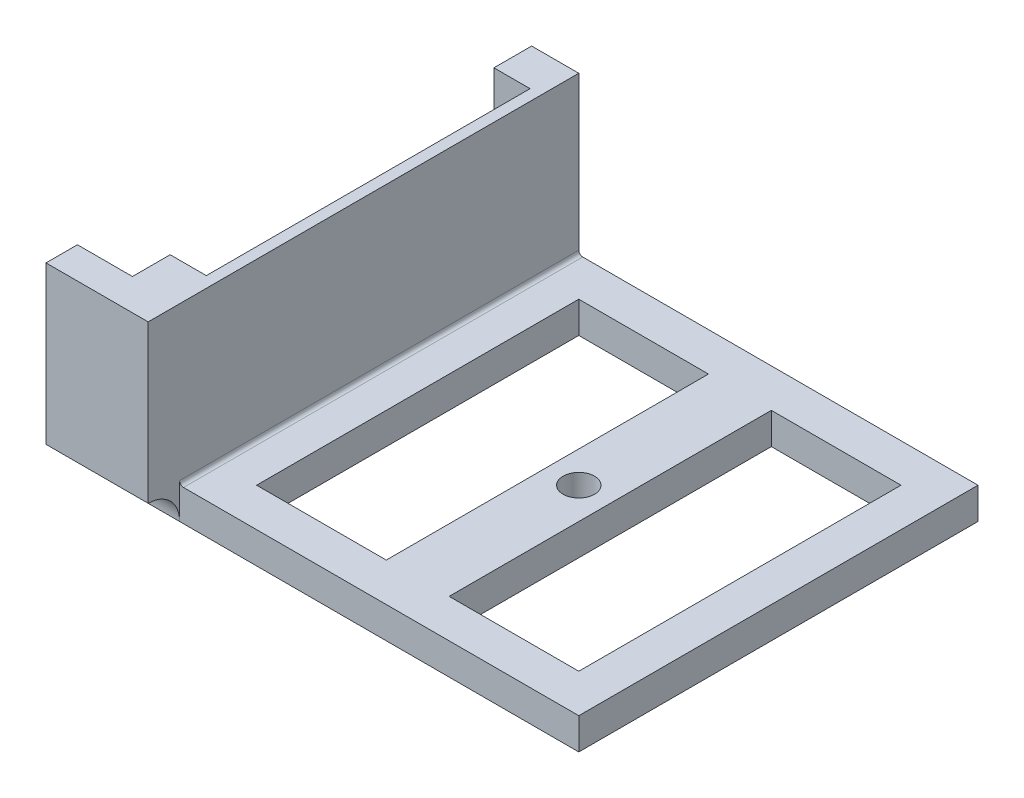
ISO-10303-21;
HEADER;
FILE_DESCRIPTION(('STEP AP214'),'2;1');
FILE_NAME('part.step','',(''),(''),'','','');
FILE_SCHEMA(('AUTOMOTIVE_DESIGN { 1 0 10303 214 1 1 1 1 }'));
ENDSEC;
DATA;
#1=APPLICATION_CONTEXT('core data for automotive mechanical design processes');
#2=APPLICATION_PROTOCOL_DEFINITION('international standard','automotive_design',2000,#1);
#3=PRODUCT_CONTEXT('',#1,'mechanical');
#4=PRODUCT('Part','Part','',(#3));
#5=PRODUCT_RELATED_PRODUCT_CATEGORY('part','',(#4));
#6=PRODUCT_DEFINITION_FORMATION('','',#4);
#7=PRODUCT_DEFINITION_CONTEXT('part definition',#1,'design');
#8=PRODUCT_DEFINITION('design','',#6,#7);
#9=PRODUCT_DEFINITION_SHAPE('','',#8);
#10=(LENGTH_UNIT() NAMED_UNIT(*) SI_UNIT(.MILLI.,.METRE.));
#11=(NAMED_UNIT(*) PLANE_ANGLE_UNIT() SI_UNIT($,.RADIAN.));
#12=(NAMED_UNIT(*) SI_UNIT($,.STERADIAN.) SOLID_ANGLE_UNIT());
#13=UNCERTAINTY_MEASURE_WITH_UNIT(LENGTH_MEASURE(1.E-05),#10,'distance_accuracy_value','');
#14=(GEOMETRIC_REPRESENTATION_CONTEXT(3) GLOBAL_UNCERTAINTY_ASSIGNED_CONTEXT((#13)) GLOBAL_UNIT_ASSIGNED_CONTEXT((#10,
#11,#12)) REPRESENTATION_CONTEXT('',''));
#15=CARTESIAN_POINT('',(0.,0.,0.));
#16=DIRECTION('',(0.,0.,1.));
#17=DIRECTION('',(1.,0.,0.));
#18=AXIS2_PLACEMENT_3D('',#15,#16,#17);
#19=CARTESIAN_POINT('',(-15.7000000000008,2.,-12.7000000000023));
#20=DIRECTION('',(1.,0.,0.));
#21=DIRECTION('',(0.,0.,-1.));
#22=AXIS2_PLACEMENT_3D('',#19,#20,#21);
#23=PLANE('',#22);
#24=DIRECTION('',(0.,0.,1.));
#25=VECTOR('',#24,1.);
#26=CARTESIAN_POINT('',(-15.7000000000008,12.,-12.7000000000023));
#27=LINE('',#26,#25);
#28=CARTESIAN_POINT('',(-15.7000000000008,12.,10.3));
#29=VERTEX_POINT('',#28);
#30=CARTESIAN_POINT('',(-15.7000000000008,12.,12.6999999999977));
#31=VERTEX_POINT('',#30);
#32=EDGE_CURVE('E258',#29,#31,#27,.T.);
#33=ORIENTED_EDGE('',*,*,#32,.F.);
#34=DIRECTION('',(0.,-1.,0.));
#35=VECTOR('',#34,1.);
#36=CARTESIAN_POINT('',(-15.7000000000008,2.,10.3));
#37=LINE('',#36,#35);
#38=CARTESIAN_POINT('',(-15.7000000000008,0.,10.3));
#39=VERTEX_POINT('',#38);
#40=EDGE_CURVE('E209',#29,#39,#37,.T.);
#41=ORIENTED_EDGE('',*,*,#40,.T.);
#42=DIRECTION('',(0.,0.,1.));
#43=VECTOR('',#42,1.);
#44=CARTESIAN_POINT('',(-15.7000000000008,0.,-12.7000000000023));
#45=LINE('',#44,#43);
#46=CARTESIAN_POINT('',(-15.7000000000008,0.,12.6999999999977));
#47=VERTEX_POINT('',#46);
#48=EDGE_CURVE('E345',#39,#47,#45,.T.);
#49=ORIENTED_EDGE('',*,*,#48,.T.);
#50=CARTESIAN_POINT('',(-15.7000000000008,0.,14.6999999999977));
#51=DIRECTION('',(1.,0.,0.));
#52=DIRECTION('',(0.,0.,-1.));
#53=AXIS2_PLACEMENT_3D('',#50,#51,#52);
#54=CIRCLE('',#53,2.);
#55=CARTESIAN_POINT('',(-15.7000000000008,2.,14.6999999999977));
#56=VERTEX_POINT('',#55);
#57=EDGE_CURVE('E11',#47,#56,#54,.T.);
#58=ORIENTED_EDGE('',*,*,#57,.T.);
#59=DIRECTION('',(0.,0.,1.));
#60=VECTOR('',#59,1.);
#61=CARTESIAN_POINT('',(-15.7000000000008,2.,-12.7000000000023));
#62=LINE('',#61,#60);
#63=CARTESIAN_POINT('',(-15.7000000000008,2.,12.6999999999977));
#64=VERTEX_POINT('',#63);
#65=EDGE_CURVE('E51',#64,#56,#62,.T.);
#66=ORIENTED_EDGE('',*,*,#65,.F.);
#67=DIRECTION('',(0.,-1.,0.));
#68=VECTOR('',#67,1.);
#69=CARTESIAN_POINT('',(-15.7000000000008,2.,12.6999999999977));
#70=LINE('',#69,#68);
#71=EDGE_CURVE('E360',#31,#64,#70,.T.);
#72=ORIENTED_EDGE('',*,*,#71,.F.);
#73=EDGE_LOOP('',(#33,#41,#49,#58,#66,#72));
#74=FACE_BOUND('',#73,.T.);
#75=ADVANCED_FACE('F37',(#74),#23,.F.);
#76=CARTESIAN_POINT('',(12.7000000000006,2.,12.6999999999977));
#77=DIRECTION('',(0.,0.,-1.));
#78=DIRECTION('',(-1.,0.,0.));
#79=AXIS2_PLACEMENT_3D('',#76,#77,#78);
#80=PLANE('',#79);
#81=DIRECTION('',(0.,1.,0.));
#82=VECTOR('',#81,1.);
#83=CARTESIAN_POINT('',(-12.7000000000008,12.,12.6999999999977));
#84=LINE('',#83,#82);
#85=CARTESIAN_POINT('',(-12.7000000000008,0.,12.6999999999977));
#86=VERTEX_POINT('',#85);
#87=CARTESIAN_POINT('',(-12.7000000000008,2.25,12.6999999999977));
#88=VERTEX_POINT('',#87);
#89=EDGE_CURVE('E59',#86,#88,#84,.T.);
#90=ORIENTED_EDGE('',*,*,#89,.F.);
#91=DIRECTION('',(1.,0.,0.));
#92=VECTOR('',#91,1.);
#93=CARTESIAN_POINT('',(12.7000000000006,0.,12.6999999999977));
#94=LINE('',#93,#92);
#95=CARTESIAN_POINT('',(12.7000000000006,0.,12.6999999999977));
#96=VERTEX_POINT('',#95);
#97=EDGE_CURVE('E349',#86,#96,#94,.T.);
#98=ORIENTED_EDGE('',*,*,#97,.T.);
#99=DIRECTION('',(0.,-1.,0.));
#100=VECTOR('',#99,1.);
#101=CARTESIAN_POINT('',(12.7000000000006,2.,12.6999999999977));
#102=LINE('',#101,#100);
#103=CARTESIAN_POINT('',(12.7000000000006,2.,12.6999999999977));
#104=VERTEX_POINT('',#103);
#105=EDGE_CURVE('E357',#104,#96,#102,.T.);
#106=ORIENTED_EDGE('',*,*,#105,.F.);
#107=DIRECTION('',(1.,0.,0.));
#108=VECTOR('',#107,1.);
#109=CARTESIAN_POINT('',(-12.7000000000008,2.,12.6999999999977));
#110=LINE('',#109,#108);
#111=CARTESIAN_POINT('',(-12.4500000000008,2.,12.6999999999977));
#112=VERTEX_POINT('',#111);
#113=EDGE_CURVE('E338',#112,#104,#110,.T.);
#114=ORIENTED_EDGE('',*,*,#113,.F.);
#115=CARTESIAN_POINT('',(-12.4500000000008,2.25,12.6999999999977));
#116=DIRECTION('',(0.,0.,-1.));
#117=DIRECTION('',(-1.,0.,0.));
#118=AXIS2_PLACEMENT_3D('',#115,#116,#117);
#119=CIRCLE('',#118,0.25);
#120=EDGE_CURVE('E373',#112,#88,#119,.T.);
#121=ORIENTED_EDGE('',*,*,#120,.T.);
#122=EDGE_LOOP('',(#90,#98,#106,#114,#121));
#123=FACE_BOUND('',#122,.T.);
#124=ADVANCED_FACE('F429',(#123),#80,.F.);
#125=CARTESIAN_POINT('',(0.,2.,0.));
#126=DIRECTION('',(0.,1.,0.));
#127=DIRECTION('',(0.,0.,1.));
#128=AXIS2_PLACEMENT_3D('',#125,#126,#127);
#129=PLANE('',#128);
#130=DIRECTION('',(-1.,0.,0.));
#131=VECTOR('',#130,1.);
#132=CARTESIAN_POINT('',(12.7000000000006,2.,-12.7000000000023));
#133=LINE('',#132,#131);
#134=CARTESIAN_POINT('',(12.7000000000006,2.,-12.7000000000023));
#135=VERTEX_POINT('',#134);
#136=CARTESIAN_POINT('',(-12.4500000000008,2.,-12.7000000000023));
#137=VERTEX_POINT('',#136);
#138=EDGE_CURVE('E335',#135,#137,#133,.T.);
#139=ORIENTED_EDGE('',*,*,#138,.T.);
#140=DIRECTION('',(0.,0.,-1.));
#141=VECTOR('',#140,1.);
#142=CARTESIAN_POINT('',(-12.4500000000008,2.,0.));
#143=LINE('',#142,#141);
#144=EDGE_CURVE('E369',#137,#112,#143,.F.);
#145=ORIENTED_EDGE('',*,*,#144,.T.);
#146=ORIENTED_EDGE('',*,*,#113,.T.);
#147=DIRECTION('',(0.,0.,-1.));
#148=VECTOR('',#147,1.);
#149=CARTESIAN_POINT('',(12.7000000000006,2.,-12.7000000000023));
#150=LINE('',#149,#148);
#151=EDGE_CURVE('E341',#104,#135,#150,.T.);
#152=ORIENTED_EDGE('',*,*,#151,.T.);
#153=EDGE_LOOP('',(#139,#145,#146,#152));
#154=FACE_BOUND('',#153,.T.);
#155=CARTESIAN_POINT('',(-6.0936740057471E-13,2.,0.));
#156=DIRECTION('',(0.,1.,0.));
#157=DIRECTION('',(0.,0.,1.));
#158=AXIS2_PLACEMENT_3D('',#155,#156,#157);
#159=CIRCLE('',#158,1.00000000000059);
#160=CARTESIAN_POINT('',(-6.0936740057471E-13,2.,1.00000000000059));
#161=VERTEX_POINT('',#160);
#162=EDGE_CURVE('E329',#161,#161,#159,.T.);
#163=ORIENTED_EDGE('',*,*,#162,.F.);
#164=EDGE_LOOP('',(#163));
#165=FACE_BOUND('',#164,.T.);
#166=DIRECTION('',(1.,0.,0.));
#167=VECTOR('',#166,1.);
#168=CARTESIAN_POINT('',(1.9999999999994,2.,10.2499999999976));
#169=LINE('',#168,#167);
#170=CARTESIAN_POINT('',(1.9999999999994,2.,10.2499999999976));
#171=VERTEX_POINT('',#170);
#172=CARTESIAN_POINT('',(10.2500000000006,2.,10.2499999999976));
#173=VERTEX_POINT('',#172);
#174=EDGE_CURVE('E300',#171,#173,#169,.T.);
#175=ORIENTED_EDGE('',*,*,#174,.F.);
#176=DIRECTION('',(0.,0.,1.));
#177=VECTOR('',#176,1.);
#178=CARTESIAN_POINT('',(1.9999999999994,2.,-10.2500000000024));
#179=LINE('',#178,#177);
#180=CARTESIAN_POINT('',(1.9999999999994,2.,-10.2500000000024));
#181=VERTEX_POINT('',#180);
#182=EDGE_CURVE('E298',#181,#171,#179,.T.);
#183=ORIENTED_EDGE('',*,*,#182,.F.);
#184=DIRECTION('',(-1.,0.,0.));
#185=VECTOR('',#184,1.);
#186=CARTESIAN_POINT('',(1.9999999999994,2.,-10.2500000000024));
#187=LINE('',#186,#185);
#188=CARTESIAN_POINT('',(10.2500000000006,2.,-10.2500000000024));
#189=VERTEX_POINT('',#188);
#190=EDGE_CURVE('E306',#189,#181,#187,.T.);
#191=ORIENTED_EDGE('',*,*,#190,.F.);
#192=DIRECTION('',(0.,0.,-1.));
#193=VECTOR('',#192,1.);
#194=CARTESIAN_POINT('',(10.2500000000006,2.,-10.2500000000024));
#195=LINE('',#194,#193);
#196=EDGE_CURVE('E303',#173,#189,#195,.T.);
#197=ORIENTED_EDGE('',*,*,#196,.F.);
#198=EDGE_LOOP('',(#175,#183,#191,#197));
#199=FACE_BOUND('',#198,.T.);
#200=DIRECTION('',(1.,0.,0.));
#201=VECTOR('',#200,1.);
#202=CARTESIAN_POINT('',(-10.2499999999994,2.,10.2499999999976));
#203=LINE('',#202,#201);
#204=CARTESIAN_POINT('',(-10.2499999999994,2.,10.2499999999976));
#205=VERTEX_POINT('',#204);
#206=CARTESIAN_POINT('',(-2.00000000000061,2.,10.2499999999976));
#207=VERTEX_POINT('',#206);
#208=EDGE_CURVE('E269',#205,#207,#203,.T.);
#209=ORIENTED_EDGE('',*,*,#208,.F.);
#210=DIRECTION('',(0.,0.,1.));
#211=VECTOR('',#210,1.);
#212=CARTESIAN_POINT('',(-10.2499999999994,2.,-10.2500000000024));
#213=LINE('',#212,#211);
#214=CARTESIAN_POINT('',(-10.2499999999994,2.,-10.2500000000024));
#215=VERTEX_POINT('',#214);
#216=EDGE_CURVE('E267',#215,#205,#213,.T.);
#217=ORIENTED_EDGE('',*,*,#216,.F.);
#218=DIRECTION('',(-1.,0.,0.));
#219=VECTOR('',#218,1.);
#220=CARTESIAN_POINT('',(-10.2499999999994,2.,-10.2500000000024));
#221=LINE('',#220,#219);
#222=CARTESIAN_POINT('',(-2.00000000000061,2.,-10.2500000000024));
#223=VERTEX_POINT('',#222);
#224=EDGE_CURVE('E275',#223,#215,#221,.T.);
#225=ORIENTED_EDGE('',*,*,#224,.F.);
#226=DIRECTION('',(0.,0.,-1.));
#227=VECTOR('',#226,1.);
#228=CARTESIAN_POINT('',(-2.00000000000061,2.,-10.2500000000024));
#229=LINE('',#228,#227);
#230=EDGE_CURVE('E272',#207,#223,#229,.T.);
#231=ORIENTED_EDGE('',*,*,#230,.F.);
#232=EDGE_LOOP('',(#209,#217,#225,#231));
#233=FACE_BOUND('',#232,.T.);
#234=ADVANCED_FACE('F423',(#154,#165,#199,#233),#129,.T.);
#235=CARTESIAN_POINT('',(0.,0.,0.));
#236=DIRECTION('',(0.,1.,0.));
#237=DIRECTION('',(0.,0.,1.));
#238=AXIS2_PLACEMENT_3D('',#235,#236,#237);
#239=PLANE('',#238);
#240=DIRECTION('',(0.,0.,1.));
#241=VECTOR('',#240,1.);
#242=CARTESIAN_POINT('',(1.9999999999994,0.,-10.2500000000024));
#243=LINE('',#242,#241);
#244=CARTESIAN_POINT('',(1.9999999999994,0.,-10.2500000000024));
#245=VERTEX_POINT('',#244);
#246=CARTESIAN_POINT('',(1.9999999999994,0.,10.2499999999976));
#247=VERTEX_POINT('',#246);
#248=EDGE_CURVE('E297',#245,#247,#243,.T.);
#249=ORIENTED_EDGE('',*,*,#248,.T.);
#250=DIRECTION('',(1.,0.,0.));
#251=VECTOR('',#250,1.);
#252=CARTESIAN_POINT('',(1.9999999999994,0.,10.2499999999976));
#253=LINE('',#252,#251);
#254=CARTESIAN_POINT('',(10.2500000000006,0.,10.2499999999976));
#255=VERTEX_POINT('',#254);
#256=EDGE_CURVE('E311',#247,#255,#253,.T.);
#257=ORIENTED_EDGE('',*,*,#256,.T.);
#258=DIRECTION('',(0.,0.,-1.));
#259=VECTOR('',#258,1.);
#260=CARTESIAN_POINT('',(10.2500000000006,0.,-10.2500000000024));
#261=LINE('',#260,#259);
#262=CARTESIAN_POINT('',(10.2500000000006,0.,-10.2500000000024));
#263=VERTEX_POINT('',#262);
#264=EDGE_CURVE('E314',#255,#263,#261,.T.);
#265=ORIENTED_EDGE('',*,*,#264,.T.);
#266=DIRECTION('',(-1.,0.,0.));
#267=VECTOR('',#266,1.);
#268=CARTESIAN_POINT('',(1.9999999999994,0.,-10.2500000000024));
#269=LINE('',#268,#267);
#270=EDGE_CURVE('E301',#263,#245,#269,.T.);
#271=ORIENTED_EDGE('',*,*,#270,.T.);
#272=EDGE_LOOP('',(#249,#257,#265,#271));
#273=FACE_BOUND('',#272,.T.);
#274=ORIENTED_EDGE('',*,*,#48,.F.);
#275=DIRECTION('',(1.,0.,0.));
#276=VECTOR('',#275,1.);
#277=CARTESIAN_POINT('',(0.,0.,10.3));
#278=LINE('',#277,#276);
#279=CARTESIAN_POINT('',(-13.4000000000008,0.,10.3));
#280=VERTEX_POINT('',#279);
#281=EDGE_CURVE('E227',#39,#280,#278,.T.);
#282=ORIENTED_EDGE('',*,*,#281,.T.);
#283=DIRECTION('',(0.,0.,-1.));
#284=VECTOR('',#283,1.);
#285=CARTESIAN_POINT('',(-13.4000000000008,0.,0.));
#286=LINE('',#285,#284);
#287=CARTESIAN_POINT('',(-13.4000000000008,0.,-10.3));
#288=VERTEX_POINT('',#287);
#289=EDGE_CURVE('E199',#280,#288,#286,.T.);
#290=ORIENTED_EDGE('',*,*,#289,.T.);
#291=DIRECTION('',(-1.,0.,0.));
#292=VECTOR('',#291,1.);
#293=CARTESIAN_POINT('',(0.,0.,-10.3));
#294=LINE('',#293,#292);
#295=CARTESIAN_POINT('',(-15.7000000000008,0.,-10.3));
#296=VERTEX_POINT('',#295);
#297=EDGE_CURVE('E222',#288,#296,#294,.T.);
#298=ORIENTED_EDGE('',*,*,#297,.T.);
#299=CARTESIAN_POINT('',(-15.7000000000008,0.,-12.7000000000023));
#300=VERTEX_POINT('',#299);
#301=EDGE_CURVE('E346',#300,#296,#45,.T.);
#302=ORIENTED_EDGE('',*,*,#301,.F.);
#303=DIRECTION('',(-1.,0.,0.));
#304=VECTOR('',#303,1.);
#305=CARTESIAN_POINT('',(-12.7000000000008,0.,-12.7000000000023));
#306=LINE('',#305,#304);
#307=CARTESIAN_POINT('',(12.7000000000006,0.,-12.7000000000023));
#308=VERTEX_POINT('',#307);
#309=EDGE_CURVE('E332',#308,#300,#306,.T.);
#310=ORIENTED_EDGE('',*,*,#309,.F.);
#311=DIRECTION('',(0.,0.,-1.));
#312=VECTOR('',#311,1.);
#313=CARTESIAN_POINT('',(12.7000000000006,0.,-12.7000000000023));
#314=LINE('',#313,#312);
#315=EDGE_CURVE('E339',#96,#308,#314,.T.);
#316=ORIENTED_EDGE('',*,*,#315,.F.);
#317=ORIENTED_EDGE('',*,*,#97,.F.);
#318=EDGE_CURVE('E350',#47,#86,#94,.T.);
#319=ORIENTED_EDGE('',*,*,#318,.F.);
#320=EDGE_LOOP('',(#274,#282,#290,#298,#302,#310,#316,#317,#319));
#321=FACE_BOUND('',#320,.T.);
#322=CARTESIAN_POINT('',(-6.0936740057471E-13,0.,0.));
#323=DIRECTION('',(0.,1.,0.));
#324=DIRECTION('',(0.,0.,1.));
#325=AXIS2_PLACEMENT_3D('',#322,#323,#324);
#326=CIRCLE('',#325,1.00000000000059);
#327=CARTESIAN_POINT('',(-6.0936740057471E-13,0.,1.00000000000059));
#328=VERTEX_POINT('',#327);
#329=EDGE_CURVE('E328',#328,#328,#326,.T.);
#330=ORIENTED_EDGE('',*,*,#329,.T.);
#331=EDGE_LOOP('',(#330));
#332=FACE_BOUND('',#331,.T.);
#333=DIRECTION('',(0.,0.,1.));
#334=VECTOR('',#333,1.);
#335=CARTESIAN_POINT('',(-10.2499999999994,0.,-10.2500000000024));
#336=LINE('',#335,#334);
#337=CARTESIAN_POINT('',(-10.2499999999994,0.,-10.2500000000024));
#338=VERTEX_POINT('',#337);
#339=CARTESIAN_POINT('',(-10.2499999999994,0.,10.2499999999976));
#340=VERTEX_POINT('',#339);
#341=EDGE_CURVE('E266',#338,#340,#336,.T.);
#342=ORIENTED_EDGE('',*,*,#341,.T.);
#343=DIRECTION('',(1.,0.,0.));
#344=VECTOR('',#343,1.);
#345=CARTESIAN_POINT('',(-10.2499999999994,0.,10.2499999999976));
#346=LINE('',#345,#344);
#347=CARTESIAN_POINT('',(-2.00000000000061,0.,10.2499999999976));
#348=VERTEX_POINT('',#347);
#349=EDGE_CURVE('E280',#340,#348,#346,.T.);
#350=ORIENTED_EDGE('',*,*,#349,.T.);
#351=DIRECTION('',(0.,0.,-1.));
#352=VECTOR('',#351,1.);
#353=CARTESIAN_POINT('',(-2.00000000000061,0.,-10.2500000000024));
#354=LINE('',#353,#352);
#355=CARTESIAN_POINT('',(-2.00000000000061,0.,-10.2500000000024));
#356=VERTEX_POINT('',#355);
#357=EDGE_CURVE('E283',#348,#356,#354,.T.);
#358=ORIENTED_EDGE('',*,*,#357,.T.);
#359=DIRECTION('',(-1.,0.,0.));
#360=VECTOR('',#359,1.);
#361=CARTESIAN_POINT('',(-10.2499999999994,0.,-10.2500000000024));
#362=LINE('',#361,#360);
#363=EDGE_CURVE('E270',#356,#338,#362,.T.);
#364=ORIENTED_EDGE('',*,*,#363,.T.);
#365=EDGE_LOOP('',(#342,#350,#358,#364));
#366=FACE_BOUND('',#365,.T.);
#367=ADVANCED_FACE('F387',(#273,#321,#332,#366),#239,.F.);
#368=CARTESIAN_POINT('',(-12.7000000000008,2.,-12.7000000000023));
#369=DIRECTION('',(0.,0.,1.));
#370=DIRECTION('',(1.,0.,0.));
#371=AXIS2_PLACEMENT_3D('',#368,#369,#370);
#372=PLANE('',#371);
#373=ORIENTED_EDGE('',*,*,#309,.T.);
#374=DIRECTION('',(0.,-1.,0.));
#375=VECTOR('',#374,1.);
#376=CARTESIAN_POINT('',(-15.7000000000008,2.,-12.7000000000023));
#377=LINE('',#376,#375);
#378=CARTESIAN_POINT('',(-15.7000000000008,12.,-12.7000000000023));
#379=VERTEX_POINT('',#378);
#380=EDGE_CURVE('E363',#379,#300,#377,.T.);
#381=ORIENTED_EDGE('',*,*,#380,.F.);
#382=DIRECTION('',(-1.,0.,0.));
#383=VECTOR('',#382,1.);
#384=CARTESIAN_POINT('',(-12.7000000000008,12.,-12.7000000000023));
#385=LINE('',#384,#383);
#386=CARTESIAN_POINT('',(-12.7000000000008,12.,-12.7000000000023));
#387=VERTEX_POINT('',#386);
#388=EDGE_CURVE('E255',#387,#379,#385,.T.);
#389=ORIENTED_EDGE('',*,*,#388,.F.);
#390=DIRECTION('',(0.,-1.,0.));
#391=VECTOR('',#390,1.);
#392=CARTESIAN_POINT('',(-12.7000000000008,12.,-12.7000000000023));
#393=LINE('',#392,#391);
#394=CARTESIAN_POINT('',(-12.7000000000008,2.25,-12.7000000000023));
#395=VERTEX_POINT('',#394);
#396=EDGE_CURVE('E263',#387,#395,#393,.T.);
#397=ORIENTED_EDGE('',*,*,#396,.T.);
#398=CARTESIAN_POINT('',(-12.4500000000008,2.25,-12.7000000000023));
#399=DIRECTION('',(0.,0.,1.));
#400=DIRECTION('',(1.,0.,0.));
#401=AXIS2_PLACEMENT_3D('',#398,#399,#400);
#402=CIRCLE('',#401,0.25);
#403=EDGE_CURVE('E371',#395,#137,#402,.T.);
#404=ORIENTED_EDGE('',*,*,#403,.T.);
#405=ORIENTED_EDGE('',*,*,#138,.F.);
#406=DIRECTION('',(0.,-1.,0.));
#407=VECTOR('',#406,1.);
#408=CARTESIAN_POINT('',(12.7000000000006,2.,-12.7000000000023));
#409=LINE('',#408,#407);
#410=EDGE_CURVE('E343',#135,#308,#409,.T.);
#411=ORIENTED_EDGE('',*,*,#410,.T.);
#412=EDGE_LOOP('',(#373,#381,#389,#397,#404,#405,#411));
#413=FACE_BOUND('',#412,.T.);
#414=ADVANCED_FACE('F409',(#413),#372,.F.);
#415=ORIENTED_EDGE('',*,*,#301,.T.);
#416=DIRECTION('',(0.,1.,0.));
#417=VECTOR('',#416,1.);
#418=CARTESIAN_POINT('',(-15.7000000000008,2.,-10.3));
#419=LINE('',#418,#417);
#420=CARTESIAN_POINT('',(-15.7000000000008,12.,-10.3));
#421=VERTEX_POINT('',#420);
#422=EDGE_CURVE('E202',#296,#421,#419,.T.);
#423=ORIENTED_EDGE('',*,*,#422,.T.);
#424=EDGE_CURVE('E259',#379,#421,#27,.T.);
#425=ORIENTED_EDGE('',*,*,#424,.F.);
#426=ORIENTED_EDGE('',*,*,#380,.T.);
#427=EDGE_LOOP('',(#415,#423,#425,#426));
#428=FACE_BOUND('',#427,.T.);
#429=ADVANCED_FACE('F413',(#428),#23,.F.);
#430=CARTESIAN_POINT('',(12.7000000000006,2.,-12.7000000000023));
#431=DIRECTION('',(-1.,0.,0.));
#432=DIRECTION('',(0.,0.,1.));
#433=AXIS2_PLACEMENT_3D('',#430,#431,#432);
#434=PLANE('',#433);
#435=ORIENTED_EDGE('',*,*,#315,.T.);
#436=ORIENTED_EDGE('',*,*,#410,.F.);
#437=ORIENTED_EDGE('',*,*,#151,.F.);
#438=ORIENTED_EDGE('',*,*,#105,.T.);
#439=EDGE_LOOP('',(#435,#436,#437,#438));
#440=FACE_BOUND('',#439,.T.);
#441=ADVANCED_FACE('F418',(#440),#434,.F.);
#442=CARTESIAN_POINT('',(-6.0936740057471E-13,2.,0.));
#443=DIRECTION('',(0.,-1.,0.));
#444=DIRECTION('',(0.,0.,-1.));
#445=AXIS2_PLACEMENT_3D('',#442,#443,#444);
#446=CYLINDRICAL_SURFACE('',#445,1.00000000000059);
#447=ORIENTED_EDGE('',*,*,#162,.T.);
#448=EDGE_LOOP('',(#447));
#449=FACE_BOUND('',#448,.T.);
#450=ORIENTED_EDGE('',*,*,#329,.F.);
#451=EDGE_LOOP('',(#450));
#452=FACE_BOUND('',#451,.T.);
#453=ADVANCED_FACE('F488',(#449,#452),#446,.F.);
#454=CARTESIAN_POINT('',(1.9999999999994,2.,-10.2500000000024));
#455=DIRECTION('',(1.,0.,0.));
#456=DIRECTION('',(0.,0.,-1.));
#457=AXIS2_PLACEMENT_3D('',#454,#455,#456);
#458=PLANE('',#457);
#459=ORIENTED_EDGE('',*,*,#248,.F.);
#460=DIRECTION('',(0.,-1.,0.));
#461=VECTOR('',#460,1.);
#462=CARTESIAN_POINT('',(1.9999999999994,2.,-10.2500000000024));
#463=LINE('',#462,#461);
#464=EDGE_CURVE('E308',#181,#245,#463,.T.);
#465=ORIENTED_EDGE('',*,*,#464,.F.);
#466=ORIENTED_EDGE('',*,*,#182,.T.);
#467=DIRECTION('',(0.,-1.,0.));
#468=VECTOR('',#467,1.);
#469=CARTESIAN_POINT('',(1.9999999999994,2.,10.2499999999976));
#470=LINE('',#469,#468);
#471=EDGE_CURVE('E325',#171,#247,#470,.T.);
#472=ORIENTED_EDGE('',*,*,#471,.T.);
#473=EDGE_LOOP('',(#459,#465,#466,#472));
#474=FACE_BOUND('',#473,.T.);
#475=ADVANCED_FACE('F484',(#474),#458,.T.);
#476=CARTESIAN_POINT('',(1.9999999999994,2.,10.2499999999976));
#477=DIRECTION('',(0.,0.,-1.));
#478=DIRECTION('',(-1.,0.,0.));
#479=AXIS2_PLACEMENT_3D('',#476,#477,#478);
#480=PLANE('',#479);
#481=ORIENTED_EDGE('',*,*,#256,.F.);
#482=ORIENTED_EDGE('',*,*,#471,.F.);
#483=ORIENTED_EDGE('',*,*,#174,.T.);
#484=DIRECTION('',(0.,-1.,0.));
#485=VECTOR('',#484,1.);
#486=CARTESIAN_POINT('',(10.2500000000006,2.,10.2499999999976));
#487=LINE('',#486,#485);
#488=EDGE_CURVE('E323',#173,#255,#487,.T.);
#489=ORIENTED_EDGE('',*,*,#488,.T.);
#490=EDGE_LOOP('',(#481,#482,#483,#489));
#491=FACE_BOUND('',#490,.T.);
#492=ADVANCED_FACE('F480',(#491),#480,.T.);
#493=CARTESIAN_POINT('',(10.2500000000006,2.,-10.2500000000024));
#494=DIRECTION('',(-1.,0.,0.));
#495=DIRECTION('',(0.,0.,1.));
#496=AXIS2_PLACEMENT_3D('',#493,#494,#495);
#497=PLANE('',#496);
#498=ORIENTED_EDGE('',*,*,#264,.F.);
#499=ORIENTED_EDGE('',*,*,#488,.F.);
#500=ORIENTED_EDGE('',*,*,#196,.T.);
#501=DIRECTION('',(0.,-1.,0.));
#502=VECTOR('',#501,1.);
#503=CARTESIAN_POINT('',(10.2500000000006,2.,-10.2500000000024));
#504=LINE('',#503,#502);
#505=EDGE_CURVE('E321',#189,#263,#504,.T.);
#506=ORIENTED_EDGE('',*,*,#505,.T.);
#507=EDGE_LOOP('',(#498,#499,#500,#506));
#508=FACE_BOUND('',#507,.T.);
#509=ADVANCED_FACE('F476',(#508),#497,.T.);
#510=CARTESIAN_POINT('',(1.9999999999994,2.,-10.2500000000024));
#511=DIRECTION('',(0.,0.,1.));
#512=DIRECTION('',(1.,0.,0.));
#513=AXIS2_PLACEMENT_3D('',#510,#511,#512);
#514=PLANE('',#513);
#515=ORIENTED_EDGE('',*,*,#270,.F.);
#516=ORIENTED_EDGE('',*,*,#505,.F.);
#517=ORIENTED_EDGE('',*,*,#190,.T.);
#518=ORIENTED_EDGE('',*,*,#464,.T.);
#519=EDGE_LOOP('',(#515,#516,#517,#518));
#520=FACE_BOUND('',#519,.T.);
#521=ADVANCED_FACE('F472',(#520),#514,.T.);
#522=CARTESIAN_POINT('',(-10.2499999999994,2.,-10.2500000000024));
#523=DIRECTION('',(1.,0.,0.));
#524=DIRECTION('',(0.,0.,-1.));
#525=AXIS2_PLACEMENT_3D('',#522,#523,#524);
#526=PLANE('',#525);
#527=ORIENTED_EDGE('',*,*,#341,.F.);
#528=DIRECTION('',(0.,-1.,0.));
#529=VECTOR('',#528,1.);
#530=CARTESIAN_POINT('',(-10.2499999999994,2.,-10.2500000000024));
#531=LINE('',#530,#529);
#532=EDGE_CURVE('E277',#215,#338,#531,.T.);
#533=ORIENTED_EDGE('',*,*,#532,.F.);
#534=ORIENTED_EDGE('',*,*,#216,.T.);
#535=DIRECTION('',(0.,-1.,0.));
#536=VECTOR('',#535,1.);
#537=CARTESIAN_POINT('',(-10.2499999999994,2.,10.2499999999976));
#538=LINE('',#537,#536);
#539=EDGE_CURVE('E294',#205,#340,#538,.T.);
#540=ORIENTED_EDGE('',*,*,#539,.T.);
#541=EDGE_LOOP('',(#527,#533,#534,#540));
#542=FACE_BOUND('',#541,.T.);
#543=ADVANCED_FACE('F468',(#542),#526,.T.);
#544=CARTESIAN_POINT('',(-10.2499999999994,2.,10.2499999999976));
#545=DIRECTION('',(0.,0.,-1.));
#546=DIRECTION('',(-1.,0.,0.));
#547=AXIS2_PLACEMENT_3D('',#544,#545,#546);
#548=PLANE('',#547);
#549=ORIENTED_EDGE('',*,*,#349,.F.);
#550=ORIENTED_EDGE('',*,*,#539,.F.);
#551=ORIENTED_EDGE('',*,*,#208,.T.);
#552=DIRECTION('',(0.,-1.,0.));
#553=VECTOR('',#552,1.);
#554=CARTESIAN_POINT('',(-2.00000000000061,2.,10.2499999999976));
#555=LINE('',#554,#553);
#556=EDGE_CURVE('E292',#207,#348,#555,.T.);
#557=ORIENTED_EDGE('',*,*,#556,.T.);
#558=EDGE_LOOP('',(#549,#550,#551,#557));
#559=FACE_BOUND('',#558,.T.);
#560=ADVANCED_FACE('F464',(#559),#548,.T.);
#561=CARTESIAN_POINT('',(-2.00000000000061,2.,-10.2500000000024));
#562=DIRECTION('',(-1.,0.,0.));
#563=DIRECTION('',(0.,0.,1.));
#564=AXIS2_PLACEMENT_3D('',#561,#562,#563);
#565=PLANE('',#564);
#566=ORIENTED_EDGE('',*,*,#357,.F.);
#567=ORIENTED_EDGE('',*,*,#556,.F.);
#568=ORIENTED_EDGE('',*,*,#230,.T.);
#569=DIRECTION('',(0.,-1.,0.));
#570=VECTOR('',#569,1.);
#571=CARTESIAN_POINT('',(-2.00000000000061,2.,-10.2500000000024));
#572=LINE('',#571,#570);
#573=EDGE_CURVE('E290',#223,#356,#572,.T.);
#574=ORIENTED_EDGE('',*,*,#573,.T.);
#575=EDGE_LOOP('',(#566,#567,#568,#574));
#576=FACE_BOUND('',#575,.T.);
#577=ADVANCED_FACE('F460',(#576),#565,.T.);
#578=CARTESIAN_POINT('',(-10.2499999999994,2.,-10.2500000000024));
#579=DIRECTION('',(0.,0.,1.));
#580=DIRECTION('',(1.,0.,0.));
#581=AXIS2_PLACEMENT_3D('',#578,#579,#580);
#582=PLANE('',#581);
#583=ORIENTED_EDGE('',*,*,#363,.F.);
#584=ORIENTED_EDGE('',*,*,#573,.F.);
#585=ORIENTED_EDGE('',*,*,#224,.T.);
#586=ORIENTED_EDGE('',*,*,#532,.T.);
#587=EDGE_LOOP('',(#583,#584,#585,#586));
#588=FACE_BOUND('',#587,.T.);
#589=ADVANCED_FACE('F453',(#588),#582,.T.);
#590=CARTESIAN_POINT('',(-12.7000000000008,12.,-12.7000000000023));
#591=DIRECTION('',(-1.,0.,0.));
#592=DIRECTION('',(0.,0.,1.));
#593=AXIS2_PLACEMENT_3D('',#590,#591,#592);
#594=PLANE('',#593);
#595=DIRECTION('',(0.,0.,-1.));
#596=VECTOR('',#595,1.);
#597=CARTESIAN_POINT('',(-12.7000000000008,12.,-12.7000000000023));
#598=LINE('',#597,#596);
#599=CARTESIAN_POINT('',(-12.7000000000008,12.,14.6999999999977));
#600=VERTEX_POINT('',#599);
#601=EDGE_CURVE('E261',#600,#387,#598,.T.);
#602=ORIENTED_EDGE('',*,*,#601,.F.);
#603=DIRECTION('',(0.,1.,0.));
#604=VECTOR('',#603,1.);
#605=CARTESIAN_POINT('',(-12.7000000000008,12.,14.6999999999977));
#606=LINE('',#605,#604);
#607=CARTESIAN_POINT('',(-12.7000000000008,2.,14.6999999999977));
#608=VERTEX_POINT('',#607);
#609=EDGE_CURVE('E238',#608,#600,#606,.T.);
#610=ORIENTED_EDGE('',*,*,#609,.F.);
#611=CARTESIAN_POINT('',(-12.7000000000008,0.,14.6999999999977));
#612=DIRECTION('',(-1.,0.,0.));
#613=DIRECTION('',(0.,0.,1.));
#614=AXIS2_PLACEMENT_3D('',#611,#612,#613);
#615=CIRCLE('',#614,2.);
#616=EDGE_CURVE('E45',#608,#86,#615,.T.);
#617=ORIENTED_EDGE('',*,*,#616,.T.);
#618=ORIENTED_EDGE('',*,*,#89,.T.);
#619=DIRECTION('',(0.,0.,-1.));
#620=VECTOR('',#619,1.);
#621=CARTESIAN_POINT('',(-12.7000000000008,2.25,-12.7000000000023));
#622=LINE('',#621,#620);
#623=EDGE_CURVE('E366',#88,#395,#622,.T.);
#624=ORIENTED_EDGE('',*,*,#623,.T.);
#625=ORIENTED_EDGE('',*,*,#396,.F.);
#626=EDGE_LOOP('',(#602,#610,#617,#618,#624,#625));
#627=FACE_BOUND('',#626,.T.);
#628=ADVANCED_FACE('F379',(#627),#594,.F.);
#629=CARTESIAN_POINT('',(0.,12.,0.));
#630=DIRECTION('',(0.,1.,0.));
#631=DIRECTION('',(0.,0.,1.));
#632=AXIS2_PLACEMENT_3D('',#629,#630,#631);
#633=PLANE('',#632);
#634=DIRECTION('',(-1.,0.,0.));
#635=VECTOR('',#634,1.);
#636=CARTESIAN_POINT('',(-16.0000000000008,12.,10.3));
#637=LINE('',#636,#635);
#638=CARTESIAN_POINT('',(-13.4000000000008,12.,10.3));
#639=VERTEX_POINT('',#638);
#640=EDGE_CURVE('E206',#639,#29,#637,.T.);
#641=ORIENTED_EDGE('',*,*,#640,.T.);
#642=ORIENTED_EDGE('',*,*,#32,.T.);
#643=DIRECTION('',(-1.,0.,0.));
#644=VECTOR('',#643,1.);
#645=CARTESIAN_POINT('',(-19.2000000000008,12.,12.6999999999977));
#646=LINE('',#645,#644);
#647=CARTESIAN_POINT('',(-19.2000000000008,12.,12.6999999999977));
#648=VERTEX_POINT('',#647);
#649=EDGE_CURVE('E234',#31,#648,#646,.T.);
#650=ORIENTED_EDGE('',*,*,#649,.T.);
#651=DIRECTION('',(0.,0.,-1.));
#652=VECTOR('',#651,1.);
#653=CARTESIAN_POINT('',(-19.2000000000008,12.,14.6999999999977));
#654=LINE('',#653,#652);
#655=CARTESIAN_POINT('',(-19.2000000000008,12.,14.6999999999977));
#656=VERTEX_POINT('',#655);
#657=EDGE_CURVE('E243',#656,#648,#654,.T.);
#658=ORIENTED_EDGE('',*,*,#657,.F.);
#659=DIRECTION('',(-1.,0.,0.));
#660=VECTOR('',#659,1.);
#661=CARTESIAN_POINT('',(-19.2000000000008,12.,14.6999999999977));
#662=LINE('',#661,#660);
#663=EDGE_CURVE('E241',#600,#656,#662,.T.);
#664=ORIENTED_EDGE('',*,*,#663,.F.);
#665=ORIENTED_EDGE('',*,*,#601,.T.);
#666=ORIENTED_EDGE('',*,*,#388,.T.);
#667=ORIENTED_EDGE('',*,*,#424,.T.);
#668=DIRECTION('',(-1.,0.,0.));
#669=VECTOR('',#668,1.);
#670=CARTESIAN_POINT('',(0.,12.,-10.3));
#671=LINE('',#670,#669);
#672=CARTESIAN_POINT('',(-13.4000000000008,12.,-10.3));
#673=VERTEX_POINT('',#672);
#674=EDGE_CURVE('E216',#673,#421,#671,.T.);
#675=ORIENTED_EDGE('',*,*,#674,.F.);
#676=DIRECTION('',(0.,0.,1.));
#677=VECTOR('',#676,1.);
#678=CARTESIAN_POINT('',(-13.4000000000008,12.,10.3));
#679=LINE('',#678,#677);
#680=EDGE_CURVE('E196',#673,#639,#679,.T.);
#681=ORIENTED_EDGE('',*,*,#680,.T.);
#682=EDGE_LOOP('',(#641,#642,#650,#658,#664,#665,#666,#667,#675,#681));
#683=FACE_BOUND('',#682,.T.);
#684=ADVANCED_FACE('F214',(#683),#633,.T.);
#685=CARTESIAN_POINT('',(-12.4500000000008,2.25,-12.7000000000023));
#686=DIRECTION('',(0.,0.,-1.));
#687=DIRECTION('',(-1.,0.,0.));
#688=AXIS2_PLACEMENT_3D('',#685,#686,#687);
#689=CYLINDRICAL_SURFACE('',#688,0.25);
#690=ORIENTED_EDGE('',*,*,#120,.F.);
#691=ORIENTED_EDGE('',*,*,#144,.F.);
#692=ORIENTED_EDGE('',*,*,#403,.F.);
#693=ORIENTED_EDGE('',*,*,#623,.F.);
#694=EDGE_LOOP('',(#690,#691,#692,#693));
#695=FACE_BOUND('',#694,.T.);
#696=ADVANCED_FACE('F428',(#695),#689,.F.);
#697=CARTESIAN_POINT('',(0.,0.,12.6999999999977));
#698=DIRECTION('',(0.,0.,1.));
#699=DIRECTION('',(1.,0.,0.));
#700=AXIS2_PLACEMENT_3D('',#697,#698,#699);
#701=PLANE('',#700);
#702=ORIENTED_EDGE('',*,*,#649,.F.);
#703=ORIENTED_EDGE('',*,*,#71,.T.);
#704=DIRECTION('',(1.,0.,0.));
#705=VECTOR('',#704,1.);
#706=CARTESIAN_POINT('',(-19.2000000000008,2.,12.6999999999977));
#707=LINE('',#706,#705);
#708=CARTESIAN_POINT('',(-19.2000000000008,2.,12.6999999999977));
#709=VERTEX_POINT('',#708);
#710=EDGE_CURVE('E246',#709,#64,#707,.T.);
#711=ORIENTED_EDGE('',*,*,#710,.F.);
#712=DIRECTION('',(0.,-1.,0.));
#713=VECTOR('',#712,1.);
#714=CARTESIAN_POINT('',(-19.2000000000008,12.,12.6999999999977));
#715=LINE('',#714,#713);
#716=EDGE_CURVE('E229',#648,#709,#715,.T.);
#717=ORIENTED_EDGE('',*,*,#716,.F.);
#718=EDGE_LOOP('',(#702,#703,#711,#717));
#719=FACE_BOUND('',#718,.T.);
#720=ADVANCED_FACE('F404',(#719),#701,.F.);
#721=CARTESIAN_POINT('',(-19.2000000000008,12.,14.6999999999977));
#722=DIRECTION('',(1.,0.,0.));
#723=DIRECTION('',(0.,1.,0.));
#724=AXIS2_PLACEMENT_3D('',#721,#722,#723);
#725=PLANE('',#724);
#726=ORIENTED_EDGE('',*,*,#716,.T.);
#727=DIRECTION('',(0.,0.,-1.));
#728=VECTOR('',#727,1.);
#729=CARTESIAN_POINT('',(-19.2000000000008,2.,14.6999999999977));
#730=LINE('',#729,#728);
#731=CARTESIAN_POINT('',(-19.2000000000008,2.,14.6999999999977));
#732=VERTEX_POINT('',#731);
#733=EDGE_CURVE('E252',#732,#709,#730,.T.);
#734=ORIENTED_EDGE('',*,*,#733,.F.);
#735=DIRECTION('',(0.,-1.,0.));
#736=VECTOR('',#735,1.);
#737=CARTESIAN_POINT('',(-19.2000000000008,12.,14.6999999999977));
#738=LINE('',#737,#736);
#739=EDGE_CURVE('E230',#656,#732,#738,.T.);
#740=ORIENTED_EDGE('',*,*,#739,.F.);
#741=ORIENTED_EDGE('',*,*,#657,.T.);
#742=EDGE_LOOP('',(#726,#734,#740,#741));
#743=FACE_BOUND('',#742,.T.);
#744=ADVANCED_FACE('F400',(#743),#725,.F.);
#745=CARTESIAN_POINT('',(-19.2000000000008,2.,14.6999999999977));
#746=DIRECTION('',(0.,1.,0.));
#747=DIRECTION('',(-1.,0.,0.));
#748=AXIS2_PLACEMENT_3D('',#745,#746,#747);
#749=PLANE('',#748);
#750=ORIENTED_EDGE('',*,*,#710,.T.);
#751=ORIENTED_EDGE('',*,*,#65,.T.);
#752=DIRECTION('',(1.,0.,0.));
#753=VECTOR('',#752,1.);
#754=CARTESIAN_POINT('',(-19.2000000000008,2.,14.6999999999977));
#755=LINE('',#754,#753);
#756=EDGE_CURVE('E235',#732,#56,#755,.T.);
#757=ORIENTED_EDGE('',*,*,#756,.F.);
#758=ORIENTED_EDGE('',*,*,#733,.T.);
#759=EDGE_LOOP('',(#750,#751,#757,#758));
#760=FACE_BOUND('',#759,.T.);
#761=ADVANCED_FACE('F392',(#760),#749,.F.);
#762=CARTESIAN_POINT('',(0.,0.,14.6999999999977));
#763=DIRECTION('',(0.,0.,1.));
#764=DIRECTION('',(1.,0.,0.));
#765=AXIS2_PLACEMENT_3D('',#762,#763,#764);
#766=PLANE('',#765);
#767=ORIENTED_EDGE('',*,*,#739,.T.);
#768=ORIENTED_EDGE('',*,*,#756,.T.);
#769=EDGE_CURVE('E233',#56,#608,#755,.T.);
#770=ORIENTED_EDGE('',*,*,#769,.T.);
#771=ORIENTED_EDGE('',*,*,#609,.T.);
#772=ORIENTED_EDGE('',*,*,#663,.T.);
#773=EDGE_LOOP('',(#767,#768,#770,#771,#772));
#774=FACE_BOUND('',#773,.T.);
#775=ADVANCED_FACE('F394',(#774),#766,.T.);
#776=CARTESIAN_POINT('',(-16.0000000000008,12.,10.3));
#777=DIRECTION('',(0.,0.,1.));
#778=DIRECTION('',(1.,0.,0.));
#779=AXIS2_PLACEMENT_3D('',#776,#777,#778);
#780=PLANE('',#779);
#781=ORIENTED_EDGE('',*,*,#40,.F.);
#782=ORIENTED_EDGE('',*,*,#640,.F.);
#783=DIRECTION('',(0.,-1.,0.));
#784=VECTOR('',#783,1.);
#785=CARTESIAN_POINT('',(-13.4000000000008,12.,10.3));
#786=LINE('',#785,#784);
#787=EDGE_CURVE('E191',#639,#280,#786,.T.);
#788=ORIENTED_EDGE('',*,*,#787,.T.);
#789=ORIENTED_EDGE('',*,*,#281,.F.);
#790=EDGE_LOOP('',(#781,#782,#788,#789));
#791=FACE_BOUND('',#790,.T.);
#792=ADVANCED_FACE('F207',(#791),#780,.F.);
#793=CARTESIAN_POINT('',(-13.4000000000008,12.,10.3));
#794=DIRECTION('',(1.,0.,0.));
#795=DIRECTION('',(0.,0.,-1.));
#796=AXIS2_PLACEMENT_3D('',#793,#794,#795);
#797=PLANE('',#796);
#798=ORIENTED_EDGE('',*,*,#787,.F.);
#799=ORIENTED_EDGE('',*,*,#680,.F.);
#800=DIRECTION('',(0.,-1.,0.));
#801=VECTOR('',#800,1.);
#802=CARTESIAN_POINT('',(-13.4000000000008,12.,-10.3));
#803=LINE('',#802,#801);
#804=EDGE_CURVE('E203',#673,#288,#803,.T.);
#805=ORIENTED_EDGE('',*,*,#804,.T.);
#806=ORIENTED_EDGE('',*,*,#289,.F.);
#807=EDGE_LOOP('',(#798,#799,#805,#806));
#808=FACE_BOUND('',#807,.T.);
#809=ADVANCED_FACE('F193',(#808),#797,.F.);
#810=CARTESIAN_POINT('',(-16.0000000000008,12.,-10.3));
#811=DIRECTION('',(0.,0.,-1.));
#812=DIRECTION('',(-1.,0.,0.));
#813=AXIS2_PLACEMENT_3D('',#810,#811,#812);
#814=PLANE('',#813);
#815=ORIENTED_EDGE('',*,*,#804,.F.);
#816=ORIENTED_EDGE('',*,*,#674,.T.);
#817=ORIENTED_EDGE('',*,*,#422,.F.);
#818=ORIENTED_EDGE('',*,*,#297,.F.);
#819=EDGE_LOOP('',(#815,#816,#817,#818));
#820=FACE_BOUND('',#819,.T.);
#821=ADVANCED_FACE('F415',(#820),#814,.F.);
#822=CARTESIAN_POINT('',(-19.2000000000008,0.,14.6999999999977));
#823=DIRECTION('',(-1.,0.,0.));
#824=DIRECTION('',(0.,-1.,0.));
#825=AXIS2_PLACEMENT_3D('',#822,#823,#824);
#826=CYLINDRICAL_SURFACE('',#825,2.);
#827=ORIENTED_EDGE('',*,*,#57,.F.);
#828=ORIENTED_EDGE('',*,*,#318,.T.);
#829=ORIENTED_EDGE('',*,*,#616,.F.);
#830=ORIENTED_EDGE('',*,*,#769,.F.);
#831=EDGE_LOOP('',(#827,#828,#829,#830));
#832=FACE_BOUND('',#831,.T.);
#833=ADVANCED_FACE('F39',(#832),#826,.F.);
#834=CLOSED_SHELL('',(#75,#124,#234,#367,#414,#429,#441,#453,#475,#492,#509,#521,#543,#560,#577,
#589,#628,#684,#696,#720,#744,#761,#775,#792,#809,#821,#833));
#835=MANIFOLD_SOLID_BREP('B2',#834);
#836=ADVANCED_BREP_SHAPE_REPRESENTATION('',(#18,#835),#14);
#837=SHAPE_DEFINITION_REPRESENTATION(#9,#836);
ENDSEC;
END-ISO-10303-21;
